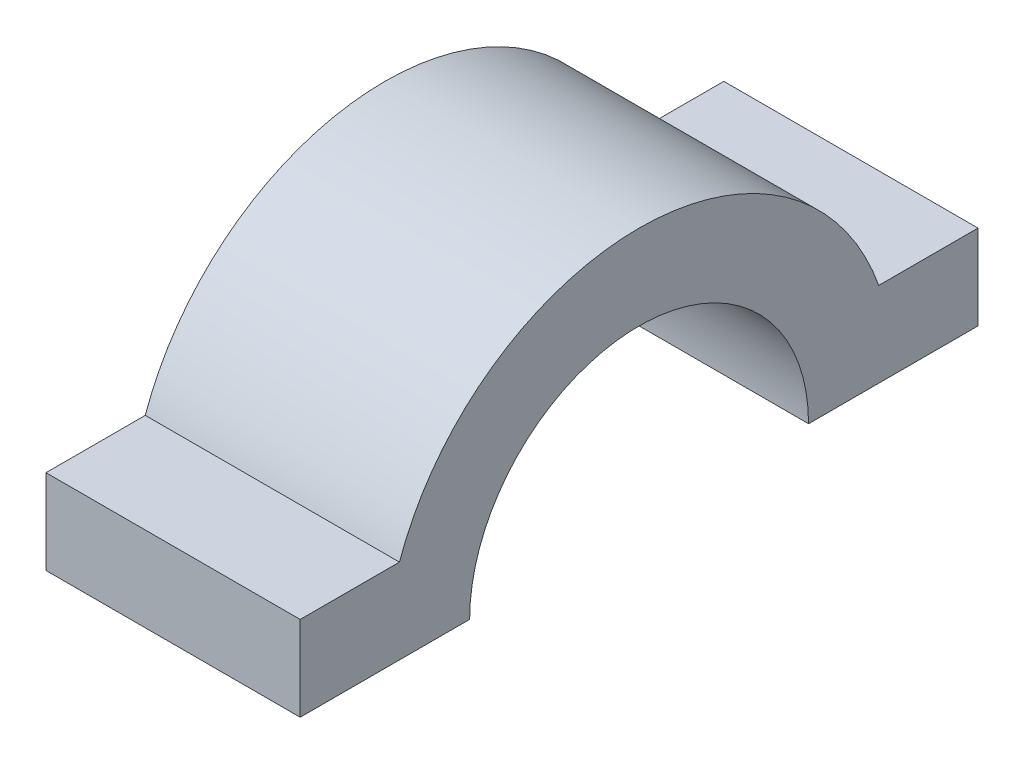
ISO-10303-21;
HEADER;
FILE_DESCRIPTION(('STEP AP214'),'2;1');
FILE_NAME('part.step','',(''),(''),'','','');
FILE_SCHEMA(('AUTOMOTIVE_DESIGN { 1 0 10303 214 1 1 1 1 }'));
ENDSEC;
DATA;
#1=APPLICATION_CONTEXT('core data for automotive mechanical design processes');
#2=APPLICATION_PROTOCOL_DEFINITION('international standard','automotive_design',2000,#1);
#3=PRODUCT_CONTEXT('',#1,'mechanical');
#4=PRODUCT('Part','Part','',(#3));
#5=PRODUCT_RELATED_PRODUCT_CATEGORY('part','',(#4));
#6=PRODUCT_DEFINITION_FORMATION('','',#4);
#7=PRODUCT_DEFINITION_CONTEXT('part definition',#1,'design');
#8=PRODUCT_DEFINITION('design','',#6,#7);
#9=PRODUCT_DEFINITION_SHAPE('','',#8);
#10=(LENGTH_UNIT() NAMED_UNIT(*) SI_UNIT(.MILLI.,.METRE.));
#11=(NAMED_UNIT(*) PLANE_ANGLE_UNIT() SI_UNIT($,.RADIAN.));
#12=(NAMED_UNIT(*) SI_UNIT($,.STERADIAN.) SOLID_ANGLE_UNIT());
#13=UNCERTAINTY_MEASURE_WITH_UNIT(LENGTH_MEASURE(1.E-05),#10,'distance_accuracy_value','');
#14=(GEOMETRIC_REPRESENTATION_CONTEXT(3) GLOBAL_UNCERTAINTY_ASSIGNED_CONTEXT((#13)) GLOBAL_UNIT_ASSIGNED_CONTEXT((#10,
#11,#12)) REPRESENTATION_CONTEXT('',''));
#15=CARTESIAN_POINT('',(0.,0.,0.));
#16=DIRECTION('',(0.,0.,1.));
#17=DIRECTION('',(1.,0.,0.));
#18=AXIS2_PLACEMENT_3D('',#15,#16,#17);
#19=CARTESIAN_POINT('',(-15.,0.,0.));
#20=DIRECTION('',(1.,0.,0.));
#21=DIRECTION('',(0.,0.,-1.));
#22=AXIS2_PLACEMENT_3D('',#19,#20,#21);
#23=CYLINDRICAL_SURFACE('',#22,10.);
#24=CARTESIAN_POINT('',(0.,0.,0.));
#25=DIRECTION('',(-1.,0.,0.));
#26=DIRECTION('',(0.,0.,1.));
#27=AXIS2_PLACEMENT_3D('',#24,#25,#26);
#28=CIRCLE('',#27,10.);
#29=CARTESIAN_POINT('',(0.,0.,10.));
#30=VERTEX_POINT('',#29);
#31=CARTESIAN_POINT('',(0.,0.,-10.));
#32=VERTEX_POINT('',#31);
#33=EDGE_CURVE('E142',#30,#32,#28,.T.);
#34=ORIENTED_EDGE('',*,*,#33,.F.);
#35=DIRECTION('',(1.,0.,0.));
#36=VECTOR('',#35,1.);
#37=CARTESIAN_POINT('',(-15.,0.,10.));
#38=LINE('',#37,#36);
#39=CARTESIAN_POINT('',(-15.,0.,10.));
#40=VERTEX_POINT('',#39);
#41=EDGE_CURVE('E11',#40,#30,#38,.T.);
#42=ORIENTED_EDGE('',*,*,#41,.F.);
#43=CARTESIAN_POINT('',(-15.,0.,0.));
#44=DIRECTION('',(-1.,0.,0.));
#45=DIRECTION('',(0.,0.,1.));
#46=AXIS2_PLACEMENT_3D('',#43,#44,#45);
#47=CIRCLE('',#46,10.);
#48=CARTESIAN_POINT('',(-15.,0.,-10.));
#49=VERTEX_POINT('',#48);
#50=EDGE_CURVE('E170',#40,#49,#47,.T.);
#51=ORIENTED_EDGE('',*,*,#50,.T.);
#52=DIRECTION('',(1.,0.,0.));
#53=VECTOR('',#52,1.);
#54=CARTESIAN_POINT('',(-15.,0.,-10.));
#55=LINE('',#54,#53);
#56=EDGE_CURVE('E42',#49,#32,#55,.T.);
#57=ORIENTED_EDGE('',*,*,#56,.T.);
#58=EDGE_LOOP('',(#34,#42,#51,#57));
#59=FACE_BOUND('',#58,.T.);
#60=ADVANCED_FACE('F39',(#59),#23,.F.);
#61=CARTESIAN_POINT('',(-15.,0.,10.));
#62=DIRECTION('',(0.,-1.,0.));
#63=DIRECTION('',(0.,0.,-1.));
#64=AXIS2_PLACEMENT_3D('',#61,#62,#63);
#65=PLANE('',#64);
#66=DIRECTION('',(0.,0.,-1.));
#67=VECTOR('',#66,1.);
#68=CARTESIAN_POINT('',(0.,0.,10.));
#69=LINE('',#68,#67);
#70=CARTESIAN_POINT('',(0.,0.,20.));
#71=VERTEX_POINT('',#70);
#72=EDGE_CURVE('E167',#71,#30,#69,.T.);
#73=ORIENTED_EDGE('',*,*,#72,.F.);
#74=DIRECTION('',(1.,0.,0.));
#75=VECTOR('',#74,1.);
#76=CARTESIAN_POINT('',(-15.,0.,20.));
#77=LINE('',#76,#75);
#78=CARTESIAN_POINT('',(-15.,0.,20.));
#79=VERTEX_POINT('',#78);
#80=EDGE_CURVE('E49',#79,#71,#77,.T.);
#81=ORIENTED_EDGE('',*,*,#80,.F.);
#82=DIRECTION('',(0.,0.,-1.));
#83=VECTOR('',#82,1.);
#84=CARTESIAN_POINT('',(-15.,0.,10.));
#85=LINE('',#84,#83);
#86=EDGE_CURVE('E128',#79,#40,#85,.T.);
#87=ORIENTED_EDGE('',*,*,#86,.T.);
#88=ORIENTED_EDGE('',*,*,#41,.T.);
#89=EDGE_LOOP('',(#73,#81,#87,#88));
#90=FACE_BOUND('',#89,.T.);
#91=ADVANCED_FACE('F188',(#90),#65,.T.);
#92=CARTESIAN_POINT('',(-15.,0.,20.));
#93=DIRECTION('',(0.,0.,1.));
#94=DIRECTION('',(1.,0.,0.));
#95=AXIS2_PLACEMENT_3D('',#92,#93,#94);
#96=PLANE('',#95);
#97=DIRECTION('',(0.,-1.,0.));
#98=VECTOR('',#97,1.);
#99=CARTESIAN_POINT('',(0.,0.,20.));
#100=LINE('',#99,#98);
#101=CARTESIAN_POINT('',(0.,5.,20.));
#102=VERTEX_POINT('',#101);
#103=EDGE_CURVE('E114',#102,#71,#100,.T.);
#104=ORIENTED_EDGE('',*,*,#103,.F.);
#105=DIRECTION('',(1.,0.,0.));
#106=VECTOR('',#105,1.);
#107=CARTESIAN_POINT('',(-15.,5.,20.));
#108=LINE('',#107,#106);
#109=CARTESIAN_POINT('',(-15.,5.,20.));
#110=VERTEX_POINT('',#109);
#111=EDGE_CURVE('E109',#110,#102,#108,.T.);
#112=ORIENTED_EDGE('',*,*,#111,.F.);
#113=DIRECTION('',(0.,-1.,0.));
#114=VECTOR('',#113,1.);
#115=CARTESIAN_POINT('',(-15.,0.,20.));
#116=LINE('',#115,#114);
#117=EDGE_CURVE('E112',#110,#79,#116,.T.);
#118=ORIENTED_EDGE('',*,*,#117,.T.);
#119=ORIENTED_EDGE('',*,*,#80,.T.);
#120=EDGE_LOOP('',(#104,#112,#118,#119));
#121=FACE_BOUND('',#120,.T.);
#122=ADVANCED_FACE('F111',(#121),#96,.T.);
#123=CARTESIAN_POINT('',(-15.,5.,20.));
#124=DIRECTION('',(0.,1.,0.));
#125=DIRECTION('',(0.,0.,1.));
#126=AXIS2_PLACEMENT_3D('',#123,#124,#125);
#127=PLANE('',#126);
#128=DIRECTION('',(0.,0.,1.));
#129=VECTOR('',#128,1.);
#130=CARTESIAN_POINT('',(0.,5.,20.));
#131=LINE('',#130,#129);
#132=CARTESIAN_POINT('',(0.,5.,14.142135623731));
#133=VERTEX_POINT('',#132);
#134=EDGE_CURVE('E162',#133,#102,#131,.T.);
#135=ORIENTED_EDGE('',*,*,#134,.F.);
#136=DIRECTION('',(1.,0.,0.));
#137=VECTOR('',#136,1.);
#138=CARTESIAN_POINT('',(-15.,5.,14.142135623731));
#139=LINE('',#138,#137);
#140=CARTESIAN_POINT('',(-15.,5.,14.142135623731));
#141=VERTEX_POINT('',#140);
#142=EDGE_CURVE('E120',#141,#133,#139,.T.);
#143=ORIENTED_EDGE('',*,*,#142,.F.);
#144=DIRECTION('',(0.,0.,1.));
#145=VECTOR('',#144,1.);
#146=CARTESIAN_POINT('',(-15.,5.,20.));
#147=LINE('',#146,#145);
#148=EDGE_CURVE('E126',#141,#110,#147,.T.);
#149=ORIENTED_EDGE('',*,*,#148,.T.);
#150=ORIENTED_EDGE('',*,*,#111,.T.);
#151=EDGE_LOOP('',(#135,#143,#149,#150));
#152=FACE_BOUND('',#151,.T.);
#153=ADVANCED_FACE('F131',(#152),#127,.T.);
#154=CARTESIAN_POINT('',(-15.,0.,0.));
#155=DIRECTION('',(1.,0.,0.));
#156=DIRECTION('',(0.,0.,-1.));
#157=AXIS2_PLACEMENT_3D('',#154,#155,#156);
#158=CYLINDRICAL_SURFACE('',#157,15.);
#159=CARTESIAN_POINT('',(0.,0.,0.));
#160=DIRECTION('',(1.,0.,0.));
#161=DIRECTION('',(0.,0.,1.));
#162=AXIS2_PLACEMENT_3D('',#159,#160,#161);
#163=CIRCLE('',#162,15.);
#164=CARTESIAN_POINT('',(0.,5.,-14.1421356237309));
#165=VERTEX_POINT('',#164);
#166=EDGE_CURVE('E158',#165,#133,#163,.T.);
#167=ORIENTED_EDGE('',*,*,#166,.F.);
#168=DIRECTION('',(1.,0.,0.));
#169=VECTOR('',#168,1.);
#170=CARTESIAN_POINT('',(-15.,5.,-14.1421356237309));
#171=LINE('',#170,#169);
#172=CARTESIAN_POINT('',(-15.,5.,-14.1421356237309));
#173=VERTEX_POINT('',#172);
#174=EDGE_CURVE('E176',#173,#165,#171,.T.);
#175=ORIENTED_EDGE('',*,*,#174,.F.);
#176=CARTESIAN_POINT('',(-15.,0.,0.));
#177=DIRECTION('',(1.,0.,0.));
#178=DIRECTION('',(0.,0.,1.));
#179=AXIS2_PLACEMENT_3D('',#176,#177,#178);
#180=CIRCLE('',#179,15.);
#181=EDGE_CURVE('E133',#173,#141,#180,.T.);
#182=ORIENTED_EDGE('',*,*,#181,.T.);
#183=ORIENTED_EDGE('',*,*,#142,.T.);
#184=EDGE_LOOP('',(#167,#175,#182,#183));
#185=FACE_BOUND('',#184,.T.);
#186=ADVANCED_FACE('F201',(#185),#158,.T.);
#187=CARTESIAN_POINT('',(-15.,5.,-20.));
#188=DIRECTION('',(0.,1.,0.));
#189=DIRECTION('',(0.,0.,1.));
#190=AXIS2_PLACEMENT_3D('',#187,#188,#189);
#191=PLANE('',#190);
#192=DIRECTION('',(0.,0.,1.));
#193=VECTOR('',#192,1.);
#194=CARTESIAN_POINT('',(0.,5.,-20.));
#195=LINE('',#194,#193);
#196=CARTESIAN_POINT('',(0.,5.,-20.));
#197=VERTEX_POINT('',#196);
#198=EDGE_CURVE('E154',#197,#165,#195,.T.);
#199=ORIENTED_EDGE('',*,*,#198,.F.);
#200=DIRECTION('',(1.,0.,0.));
#201=VECTOR('',#200,1.);
#202=CARTESIAN_POINT('',(-15.,5.,-20.));
#203=LINE('',#202,#201);
#204=CARTESIAN_POINT('',(-15.,5.,-20.));
#205=VERTEX_POINT('',#204);
#206=EDGE_CURVE('E179',#205,#197,#203,.T.);
#207=ORIENTED_EDGE('',*,*,#206,.F.);
#208=DIRECTION('',(0.,0.,1.));
#209=VECTOR('',#208,1.);
#210=CARTESIAN_POINT('',(-15.,5.,-20.));
#211=LINE('',#210,#209);
#212=EDGE_CURVE('E136',#205,#173,#211,.T.);
#213=ORIENTED_EDGE('',*,*,#212,.T.);
#214=ORIENTED_EDGE('',*,*,#174,.T.);
#215=EDGE_LOOP('',(#199,#207,#213,#214));
#216=FACE_BOUND('',#215,.T.);
#217=ADVANCED_FACE('F204',(#216),#191,.T.);
#218=CARTESIAN_POINT('',(-15.,0.,-20.));
#219=DIRECTION('',(0.,0.,-1.));
#220=DIRECTION('',(-1.,0.,0.));
#221=AXIS2_PLACEMENT_3D('',#218,#219,#220);
#222=PLANE('',#221);
#223=DIRECTION('',(0.,1.,0.));
#224=VECTOR('',#223,1.);
#225=CARTESIAN_POINT('',(0.,0.,-20.));
#226=LINE('',#225,#224);
#227=CARTESIAN_POINT('',(0.,0.,-20.));
#228=VERTEX_POINT('',#227);
#229=EDGE_CURVE('E150',#228,#197,#226,.T.);
#230=ORIENTED_EDGE('',*,*,#229,.F.);
#231=DIRECTION('',(1.,0.,0.));
#232=VECTOR('',#231,1.);
#233=CARTESIAN_POINT('',(-15.,0.,-20.));
#234=LINE('',#233,#232);
#235=CARTESIAN_POINT('',(-15.,0.,-20.));
#236=VERTEX_POINT('',#235);
#237=EDGE_CURVE('E181',#236,#228,#234,.T.);
#238=ORIENTED_EDGE('',*,*,#237,.F.);
#239=DIRECTION('',(0.,1.,0.));
#240=VECTOR('',#239,1.);
#241=CARTESIAN_POINT('',(-15.,0.,-20.));
#242=LINE('',#241,#240);
#243=EDGE_CURVE('E279',#236,#205,#242,.T.);
#244=ORIENTED_EDGE('',*,*,#243,.T.);
#245=ORIENTED_EDGE('',*,*,#206,.T.);
#246=EDGE_LOOP('',(#230,#238,#244,#245));
#247=FACE_BOUND('',#246,.T.);
#248=ADVANCED_FACE('F208',(#247),#222,.T.);
#249=CARTESIAN_POINT('',(-15.,0.,-10.));
#250=DIRECTION('',(0.,-1.,0.));
#251=DIRECTION('',(0.,0.,-1.));
#252=AXIS2_PLACEMENT_3D('',#249,#250,#251);
#253=PLANE('',#252);
#254=DIRECTION('',(0.,0.,-1.));
#255=VECTOR('',#254,1.);
#256=CARTESIAN_POINT('',(0.,0.,-10.));
#257=LINE('',#256,#255);
#258=EDGE_CURVE('E146',#32,#228,#257,.T.);
#259=ORIENTED_EDGE('',*,*,#258,.F.);
#260=ORIENTED_EDGE('',*,*,#56,.F.);
#261=DIRECTION('',(0.,0.,-1.));
#262=VECTOR('',#261,1.);
#263=CARTESIAN_POINT('',(-15.,0.,-10.));
#264=LINE('',#263,#262);
#265=EDGE_CURVE('E282',#49,#236,#264,.T.);
#266=ORIENTED_EDGE('',*,*,#265,.T.);
#267=ORIENTED_EDGE('',*,*,#237,.T.);
#268=EDGE_LOOP('',(#259,#260,#266,#267));
#269=FACE_BOUND('',#268,.T.);
#270=ADVANCED_FACE('F185',(#269),#253,.T.);
#271=CARTESIAN_POINT('',(-15.,0.,0.));
#272=DIRECTION('',(-1.,0.,0.));
#273=DIRECTION('',(0.,0.,1.));
#274=AXIS2_PLACEMENT_3D('',#271,#272,#273);
#275=PLANE('',#274);
#276=ORIENTED_EDGE('',*,*,#50,.F.);
#277=ORIENTED_EDGE('',*,*,#86,.F.);
#278=ORIENTED_EDGE('',*,*,#117,.F.);
#279=ORIENTED_EDGE('',*,*,#148,.F.);
#280=ORIENTED_EDGE('',*,*,#181,.F.);
#281=ORIENTED_EDGE('',*,*,#212,.F.);
#282=ORIENTED_EDGE('',*,*,#243,.F.);
#283=ORIENTED_EDGE('',*,*,#265,.F.);
#284=EDGE_LOOP('',(#276,#277,#278,#279,#280,#281,#282,#283));
#285=FACE_BOUND('',#284,.T.);
#286=ADVANCED_FACE('F124',(#285),#275,.T.);
#287=CARTESIAN_POINT('',(0.,0.,0.));
#288=DIRECTION('',(-1.,0.,0.));
#289=DIRECTION('',(0.,0.,1.));
#290=AXIS2_PLACEMENT_3D('',#287,#288,#289);
#291=PLANE('',#290);
#292=ORIENTED_EDGE('',*,*,#33,.T.);
#293=ORIENTED_EDGE('',*,*,#258,.T.);
#294=ORIENTED_EDGE('',*,*,#229,.T.);
#295=ORIENTED_EDGE('',*,*,#198,.T.);
#296=ORIENTED_EDGE('',*,*,#166,.T.);
#297=ORIENTED_EDGE('',*,*,#134,.T.);
#298=ORIENTED_EDGE('',*,*,#103,.T.);
#299=ORIENTED_EDGE('',*,*,#72,.T.);
#300=EDGE_LOOP('',(#292,#293,#294,#295,#296,#297,#298,#299));
#301=FACE_BOUND('',#300,.T.);
#302=ADVANCED_FACE('F187',(#301),#291,.F.);
#303=CLOSED_SHELL('',(#60,#91,#122,#153,#186,#217,#248,#270,#286,#302));
#304=MANIFOLD_SOLID_BREP('B2',#303);
#305=ADVANCED_BREP_SHAPE_REPRESENTATION('',(#18,#304),#14);
#306=SHAPE_DEFINITION_REPRESENTATION(#9,#305);
ENDSEC;
END-ISO-10303-21;
